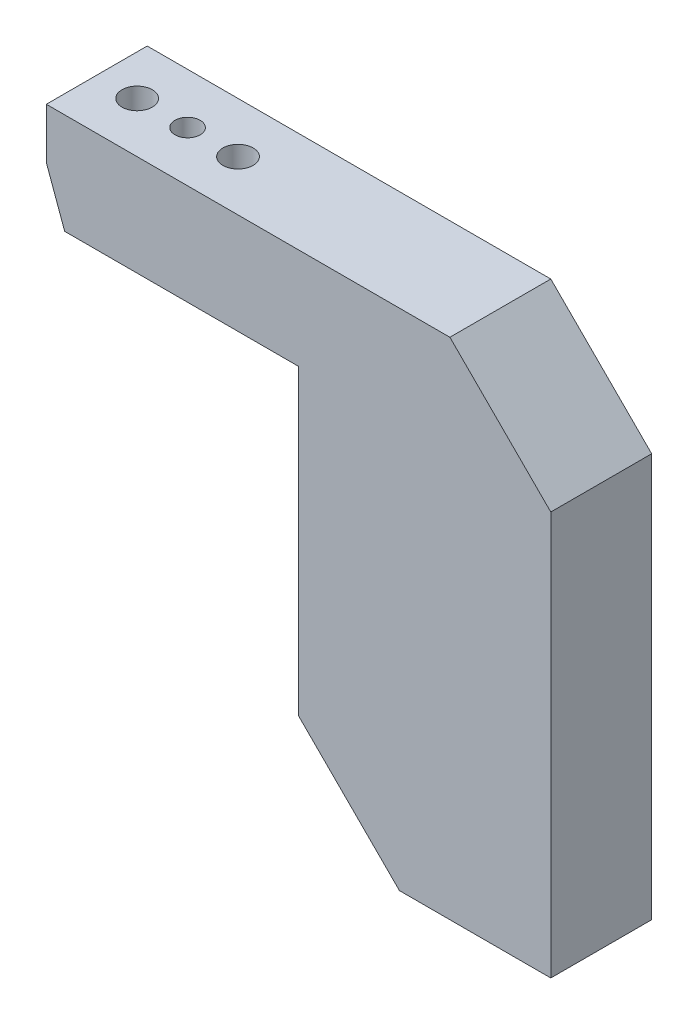
ISO-10303-21;
HEADER;
FILE_DESCRIPTION(('STEP AP214'),'2;1');
FILE_NAME('part.step','',(''),(''),'','','');
FILE_SCHEMA(('AUTOMOTIVE_DESIGN { 1 0 10303 214 1 1 1 1 }'));
ENDSEC;
DATA;
#1=APPLICATION_CONTEXT('core data for automotive mechanical design processes');
#2=APPLICATION_PROTOCOL_DEFINITION('international standard','automotive_design',2000,#1);
#3=PRODUCT_CONTEXT('',#1,'mechanical');
#4=PRODUCT('Part','Part','',(#3));
#5=PRODUCT_RELATED_PRODUCT_CATEGORY('part','',(#4));
#6=PRODUCT_DEFINITION_FORMATION('','',#4);
#7=PRODUCT_DEFINITION_CONTEXT('part definition',#1,'design');
#8=PRODUCT_DEFINITION('design','',#6,#7);
#9=PRODUCT_DEFINITION_SHAPE('','',#8);
#10=(LENGTH_UNIT() NAMED_UNIT(*) SI_UNIT(.MILLI.,.METRE.));
#11=(NAMED_UNIT(*) PLANE_ANGLE_UNIT() SI_UNIT($,.RADIAN.));
#12=(NAMED_UNIT(*) SI_UNIT($,.STERADIAN.) SOLID_ANGLE_UNIT());
#13=UNCERTAINTY_MEASURE_WITH_UNIT(LENGTH_MEASURE(1.E-05),#10,'distance_accuracy_value','');
#14=(GEOMETRIC_REPRESENTATION_CONTEXT(3) GLOBAL_UNCERTAINTY_ASSIGNED_CONTEXT((#13)) GLOBAL_UNIT_ASSIGNED_CONTEXT((#10,
#11,#12)) REPRESENTATION_CONTEXT('',''));
#15=CARTESIAN_POINT('',(0.,0.,0.));
#16=DIRECTION('',(0.,0.,1.));
#17=DIRECTION('',(1.,0.,0.));
#18=AXIS2_PLACEMENT_3D('',#15,#16,#17);
#19=CARTESIAN_POINT('',(-50.,-50.,20.));
#20=DIRECTION('',(1.,0.,0.));
#21=DIRECTION('',(0.,0.,-1.));
#22=AXIS2_PLACEMENT_3D('',#19,#20,#21);
#23=PLANE('',#22);
#24=DIRECTION('',(0.,-1.,0.));
#25=VECTOR('',#24,1.);
#26=CARTESIAN_POINT('',(-50.,-50.,0.));
#27=LINE('',#26,#25);
#28=CARTESIAN_POINT('',(-50.,50.,0.));
#29=VERTEX_POINT('',#28);
#30=CARTESIAN_POINT('',(-50.,40.0000000000002,0.));
#31=VERTEX_POINT('',#30);
#32=EDGE_CURVE('E162',#29,#31,#27,.T.);
#33=ORIENTED_EDGE('',*,*,#32,.T.);
#34=DIRECTION('',(0.,0.,1.));
#35=VECTOR('',#34,1.);
#36=CARTESIAN_POINT('',(-50.,40.0000000000002,20.));
#37=LINE('',#36,#35);
#38=CARTESIAN_POINT('',(-50.,40.0000000000001,20.));
#39=VERTEX_POINT('',#38);
#40=EDGE_CURVE('E189',#31,#39,#37,.T.);
#41=ORIENTED_EDGE('',*,*,#40,.T.);
#42=DIRECTION('',(0.,-1.,0.));
#43=VECTOR('',#42,1.);
#44=CARTESIAN_POINT('',(-50.,-50.,20.));
#45=LINE('',#44,#43);
#46=CARTESIAN_POINT('',(-50.,50.,20.));
#47=VERTEX_POINT('',#46);
#48=EDGE_CURVE('E163',#47,#39,#45,.T.);
#49=ORIENTED_EDGE('',*,*,#48,.F.);
#50=DIRECTION('',(0.,0.,-1.));
#51=VECTOR('',#50,1.);
#52=CARTESIAN_POINT('',(-50.,50.,20.));
#53=LINE('',#52,#51);
#54=EDGE_CURVE('E172',#47,#29,#53,.T.);
#55=ORIENTED_EDGE('',*,*,#54,.T.);
#56=EDGE_LOOP('',(#33,#41,#49,#55));
#57=FACE_BOUND('',#56,.T.);
#58=ADVANCED_FACE('F39',(#57),#23,.F.);
#59=CARTESIAN_POINT('',(50.,-50.,20.));
#60=DIRECTION('',(0.,1.,0.));
#61=DIRECTION('',(-1.,0.,0.));
#62=AXIS2_PLACEMENT_3D('',#59,#60,#61);
#63=PLANE('',#62);
#64=DIRECTION('',(1.,0.,0.));
#65=VECTOR('',#64,1.);
#66=CARTESIAN_POINT('',(50.,-50.,20.));
#67=LINE('',#66,#65);
#68=CARTESIAN_POINT('',(20.0000000000001,-50.,20.));
#69=VERTEX_POINT('',#68);
#70=CARTESIAN_POINT('',(50.,-50.,20.));
#71=VERTEX_POINT('',#70);
#72=EDGE_CURVE('E165',#69,#71,#67,.T.);
#73=ORIENTED_EDGE('',*,*,#72,.F.);
#74=DIRECTION('',(0.,0.,-1.));
#75=VECTOR('',#74,1.);
#76=CARTESIAN_POINT('',(20.,-50.,20.));
#77=LINE('',#76,#75);
#78=CARTESIAN_POINT('',(20.,-50.,0.));
#79=VERTEX_POINT('',#78);
#80=EDGE_CURVE('E192',#69,#79,#77,.T.);
#81=ORIENTED_EDGE('',*,*,#80,.T.);
#82=DIRECTION('',(1.,0.,0.));
#83=VECTOR('',#82,1.);
#84=CARTESIAN_POINT('',(50.,-50.,0.));
#85=LINE('',#84,#83);
#86=CARTESIAN_POINT('',(50.,-50.,0.));
#87=VERTEX_POINT('',#86);
#88=EDGE_CURVE('E175',#79,#87,#85,.T.);
#89=ORIENTED_EDGE('',*,*,#88,.T.);
#90=DIRECTION('',(0.,0.,-1.));
#91=VECTOR('',#90,1.);
#92=CARTESIAN_POINT('',(50.,-50.,20.));
#93=LINE('',#92,#91);
#94=EDGE_CURVE('E182',#71,#87,#93,.T.);
#95=ORIENTED_EDGE('',*,*,#94,.F.);
#96=EDGE_LOOP('',(#73,#81,#89,#95));
#97=FACE_BOUND('',#96,.T.);
#98=ADVANCED_FACE('F224',(#97),#63,.F.);
#99=CARTESIAN_POINT('',(50.,-50.,20.));
#100=DIRECTION('',(-1.,0.,0.));
#101=DIRECTION('',(0.,0.,1.));
#102=AXIS2_PLACEMENT_3D('',#99,#100,#101);
#103=PLANE('',#102);
#104=DIRECTION('',(0.,1.,0.));
#105=VECTOR('',#104,1.);
#106=CARTESIAN_POINT('',(50.,-50.,0.));
#107=LINE('',#106,#105);
#108=CARTESIAN_POINT('',(50.,29.9999999999999,0.));
#109=VERTEX_POINT('',#108);
#110=EDGE_CURVE('E177',#87,#109,#107,.T.);
#111=ORIENTED_EDGE('',*,*,#110,.T.);
#112=DIRECTION('',(0.,0.,1.));
#113=VECTOR('',#112,1.);
#114=CARTESIAN_POINT('',(50.,29.9999999999999,20.));
#115=LINE('',#114,#113);
#116=CARTESIAN_POINT('',(50.,29.9999999999999,20.));
#117=VERTEX_POINT('',#116);
#118=EDGE_CURVE('E47',#109,#117,#115,.T.);
#119=ORIENTED_EDGE('',*,*,#118,.T.);
#120=DIRECTION('',(0.,1.,0.));
#121=VECTOR('',#120,1.);
#122=CARTESIAN_POINT('',(50.,-50.,20.));
#123=LINE('',#122,#121);
#124=EDGE_CURVE('E168',#71,#117,#123,.T.);
#125=ORIENTED_EDGE('',*,*,#124,.F.);
#126=ORIENTED_EDGE('',*,*,#94,.T.);
#127=EDGE_LOOP('',(#111,#119,#125,#126));
#128=FACE_BOUND('',#127,.T.);
#129=ADVANCED_FACE('F225',(#128),#103,.F.);
#130=CARTESIAN_POINT('',(50.,50.,20.));
#131=DIRECTION('',(0.,-1.,0.));
#132=DIRECTION('',(1.,0.,0.));
#133=AXIS2_PLACEMENT_3D('',#130,#131,#132);
#134=PLANE('',#133);
#135=CARTESIAN_POINT('',(-32.,50.,10.));
#136=DIRECTION('',(0.,1.,0.));
#137=DIRECTION('',(0.,0.,1.));
#138=AXIS2_PLACEMENT_3D('',#135,#136,#137);
#139=CIRCLE('',#138,2.5);
#140=CARTESIAN_POINT('',(-32.,50.,12.5));
#141=VERTEX_POINT('',#140);
#142=EDGE_CURVE('E150',#141,#141,#139,.T.);
#143=ORIENTED_EDGE('',*,*,#142,.F.);
#144=EDGE_LOOP('',(#143));
#145=FACE_BOUND('',#144,.T.);
#146=CARTESIAN_POINT('',(-22.,50.,10.));
#147=DIRECTION('',(0.,1.,0.));
#148=DIRECTION('',(0.,0.,1.));
#149=AXIS2_PLACEMENT_3D('',#146,#147,#148);
#150=CIRCLE('',#149,3.);
#151=CARTESIAN_POINT('',(-22.,50.,13.));
#152=VERTEX_POINT('',#151);
#153=EDGE_CURVE('E156',#152,#152,#150,.T.);
#154=ORIENTED_EDGE('',*,*,#153,.F.);
#155=EDGE_LOOP('',(#154));
#156=FACE_BOUND('',#155,.T.);
#157=CARTESIAN_POINT('',(-42.,50.,10.));
#158=DIRECTION('',(0.,1.,0.));
#159=DIRECTION('',(0.,0.,1.));
#160=AXIS2_PLACEMENT_3D('',#157,#158,#159);
#161=CIRCLE('',#160,3.);
#162=CARTESIAN_POINT('',(-42.,50.,13.));
#163=VERTEX_POINT('',#162);
#164=EDGE_CURVE('E159',#163,#163,#161,.T.);
#165=ORIENTED_EDGE('',*,*,#164,.F.);
#166=EDGE_LOOP('',(#165));
#167=FACE_BOUND('',#166,.T.);
#168=DIRECTION('',(-1.,0.,0.));
#169=VECTOR('',#168,1.);
#170=CARTESIAN_POINT('',(50.,50.,20.));
#171=LINE('',#170,#169);
#172=CARTESIAN_POINT('',(30.,50.,20.));
#173=VERTEX_POINT('',#172);
#174=EDGE_CURVE('E170',#173,#47,#171,.T.);
#175=ORIENTED_EDGE('',*,*,#174,.F.);
#176=DIRECTION('',(0.,0.,-1.));
#177=VECTOR('',#176,1.);
#178=CARTESIAN_POINT('',(30.,50.,20.));
#179=LINE('',#178,#177);
#180=CARTESIAN_POINT('',(30.,50.,0.));
#181=VERTEX_POINT('',#180);
#182=EDGE_CURVE('E200',#173,#181,#179,.T.);
#183=ORIENTED_EDGE('',*,*,#182,.T.);
#184=DIRECTION('',(-1.,0.,0.));
#185=VECTOR('',#184,1.);
#186=CARTESIAN_POINT('',(50.,50.,0.));
#187=LINE('',#186,#185);
#188=EDGE_CURVE('E166',#181,#29,#187,.T.);
#189=ORIENTED_EDGE('',*,*,#188,.T.);
#190=ORIENTED_EDGE('',*,*,#54,.F.);
#191=EDGE_LOOP('',(#175,#183,#189,#190));
#192=FACE_BOUND('',#191,.T.);
#193=ADVANCED_FACE('F206',(#145,#156,#167,#192),#134,.F.);
#194=CARTESIAN_POINT('',(0.,0.,20.));
#195=DIRECTION('',(0.,0.,1.));
#196=DIRECTION('',(1.,0.,0.));
#197=AXIS2_PLACEMENT_3D('',#194,#195,#196);
#198=PLANE('',#197);
#199=ORIENTED_EDGE('',*,*,#124,.T.);
#200=DIRECTION('',(0.707106781186546,-0.707106781186549,0.));
#201=VECTOR('',#200,1.);
#202=CARTESIAN_POINT('',(40.,39.9999999999999,20.));
#203=LINE('',#202,#201);
#204=EDGE_CURVE('E11',#117,#173,#203,.F.);
#205=ORIENTED_EDGE('',*,*,#204,.T.);
#206=ORIENTED_EDGE('',*,*,#174,.T.);
#207=ORIENTED_EDGE('',*,*,#48,.T.);
#208=DIRECTION('',(-0.342020143325666,0.939692620785909,0.));
#209=VECTOR('',#208,1.);
#210=CARTESIAN_POINT('',(-31.2953588842438,-11.390579104543,20.));
#211=LINE('',#210,#209);
#212=CARTESIAN_POINT('',(-46.360297657338,30.,20.));
#213=VERTEX_POINT('',#212);
#214=EDGE_CURVE('E121',#39,#213,#211,.F.);
#215=ORIENTED_EDGE('',*,*,#214,.T.);
#216=DIRECTION('',(1.,0.,0.));
#217=VECTOR('',#216,1.);
#218=CARTESIAN_POINT('',(-50.,30.,20.));
#219=LINE('',#218,#217);
#220=CARTESIAN_POINT('',(0.,30.,20.));
#221=VERTEX_POINT('',#220);
#222=EDGE_CURVE('E113',#213,#221,#219,.T.);
#223=ORIENTED_EDGE('',*,*,#222,.T.);
#224=DIRECTION('',(0.,-1.,0.));
#225=VECTOR('',#224,1.);
#226=CARTESIAN_POINT('',(0.,30.,20.));
#227=LINE('',#226,#225);
#228=CARTESIAN_POINT('',(0.,-29.9999999999999,20.));
#229=VERTEX_POINT('',#228);
#230=EDGE_CURVE('E117',#221,#229,#227,.T.);
#231=ORIENTED_EDGE('',*,*,#230,.T.);
#232=DIRECTION('',(-0.707106781186546,0.707106781186549,0.));
#233=VECTOR('',#232,1.);
#234=CARTESIAN_POINT('',(-14.9999999999999,-14.9999999999999,20.));
#235=LINE('',#234,#233);
#236=EDGE_CURVE('E198',#229,#69,#235,.F.);
#237=ORIENTED_EDGE('',*,*,#236,.T.);
#238=ORIENTED_EDGE('',*,*,#72,.T.);
#239=EDGE_LOOP('',(#199,#205,#206,#207,#215,#223,#231,#237,#238));
#240=FACE_BOUND('',#239,.T.);
#241=ADVANCED_FACE('F115',(#240),#198,.T.);
#242=CARTESIAN_POINT('',(0.,0.,0.));
#243=DIRECTION('',(0.,0.,1.));
#244=DIRECTION('',(1.,0.,0.));
#245=AXIS2_PLACEMENT_3D('',#242,#243,#244);
#246=PLANE('',#245);
#247=ORIENTED_EDGE('',*,*,#188,.F.);
#248=DIRECTION('',(-0.707106781186546,0.707106781186549,0.));
#249=VECTOR('',#248,1.);
#250=CARTESIAN_POINT('',(30.,50.,0.));
#251=LINE('',#250,#249);
#252=EDGE_CURVE('E61',#181,#109,#251,.F.);
#253=ORIENTED_EDGE('',*,*,#252,.T.);
#254=ORIENTED_EDGE('',*,*,#110,.F.);
#255=ORIENTED_EDGE('',*,*,#88,.F.);
#256=DIRECTION('',(0.707106781186546,-0.707106781186549,0.));
#257=VECTOR('',#256,1.);
#258=CARTESIAN_POINT('',(20.,-50.,0.));
#259=LINE('',#258,#257);
#260=CARTESIAN_POINT('',(0.,-29.9999999999999,0.));
#261=VERTEX_POINT('',#260);
#262=EDGE_CURVE('E195',#79,#261,#259,.F.);
#263=ORIENTED_EDGE('',*,*,#262,.T.);
#264=DIRECTION('',(0.,-1.,0.));
#265=VECTOR('',#264,1.);
#266=CARTESIAN_POINT('',(0.,30.,0.));
#267=LINE('',#266,#265);
#268=CARTESIAN_POINT('',(0.,30.,0.));
#269=VERTEX_POINT('',#268);
#270=EDGE_CURVE('E125',#269,#261,#267,.T.);
#271=ORIENTED_EDGE('',*,*,#270,.F.);
#272=DIRECTION('',(1.,0.,0.));
#273=VECTOR('',#272,1.);
#274=CARTESIAN_POINT('',(-50.,30.,0.));
#275=LINE('',#274,#273);
#276=CARTESIAN_POINT('',(-46.360297657338,30.,0.));
#277=VERTEX_POINT('',#276);
#278=EDGE_CURVE('E132',#277,#269,#275,.T.);
#279=ORIENTED_EDGE('',*,*,#278,.F.);
#280=DIRECTION('',(0.342020143325666,-0.939692620785909,0.));
#281=VECTOR('',#280,1.);
#282=CARTESIAN_POINT('',(-46.360297657338,30.,0.));
#283=LINE('',#282,#281);
#284=EDGE_CURVE('E187',#277,#31,#283,.F.);
#285=ORIENTED_EDGE('',*,*,#284,.T.);
#286=ORIENTED_EDGE('',*,*,#32,.F.);
#287=EDGE_LOOP('',(#247,#253,#254,#255,#263,#271,#279,#285,#286));
#288=FACE_BOUND('',#287,.T.);
#289=ADVANCED_FACE('F211',(#288),#246,.F.);
#290=CARTESIAN_POINT('',(-42.,50.,10.));
#291=DIRECTION('',(0.,1.,0.));
#292=DIRECTION('',(0.,0.,1.));
#293=AXIS2_PLACEMENT_3D('',#290,#291,#292);
#294=CYLINDRICAL_SURFACE('',#293,3.);
#295=CARTESIAN_POINT('',(-42.,30.,10.));
#296=DIRECTION('',(0.,1.,0.));
#297=DIRECTION('',(-1.,0.,0.));
#298=AXIS2_PLACEMENT_3D('',#295,#296,#297);
#299=CIRCLE('',#298,3.);
#300=CARTESIAN_POINT('',(-45.,30.,10.));
#301=VERTEX_POINT('',#300);
#302=EDGE_CURVE('E147',#301,#301,#299,.F.);
#303=ORIENTED_EDGE('',*,*,#302,.T.);
#304=EDGE_LOOP('',(#303));
#305=FACE_BOUND('',#304,.T.);
#306=ORIENTED_EDGE('',*,*,#164,.T.);
#307=EDGE_LOOP('',(#306));
#308=FACE_BOUND('',#307,.T.);
#309=ADVANCED_FACE('F262',(#305,#308),#294,.F.);
#310=CARTESIAN_POINT('',(-22.,50.,10.));
#311=DIRECTION('',(0.,1.,0.));
#312=DIRECTION('',(0.,0.,1.));
#313=AXIS2_PLACEMENT_3D('',#310,#311,#312);
#314=CYLINDRICAL_SURFACE('',#313,3.);
#315=CARTESIAN_POINT('',(-22.,30.,10.));
#316=DIRECTION('',(0.,1.,0.));
#317=DIRECTION('',(-1.,0.,0.));
#318=AXIS2_PLACEMENT_3D('',#315,#316,#317);
#319=CIRCLE('',#318,3.);
#320=CARTESIAN_POINT('',(-25.,30.,10.));
#321=VERTEX_POINT('',#320);
#322=EDGE_CURVE('E136',#321,#321,#319,.F.);
#323=ORIENTED_EDGE('',*,*,#322,.T.);
#324=EDGE_LOOP('',(#323));
#325=FACE_BOUND('',#324,.T.);
#326=ORIENTED_EDGE('',*,*,#153,.T.);
#327=EDGE_LOOP('',(#326));
#328=FACE_BOUND('',#327,.T.);
#329=ADVANCED_FACE('F258',(#325,#328),#314,.F.);
#330=CARTESIAN_POINT('',(-32.,35.,10.));
#331=DIRECTION('',(0.,1.,0.));
#332=DIRECTION('',(0.,0.,1.));
#333=AXIS2_PLACEMENT_3D('',#330,#331,#332);
#334=CONICAL_SURFACE('',#333,2.5,1.02974425867665);
#335=CARTESIAN_POINT('',(-32.,33.4978484524311,10.));
#336=VERTEX_POINT('',#335);
#337=VERTEX_LOOP('',#336);
#338=FACE_BOUND('',#337,.T.);
#339=CARTESIAN_POINT('',(-32.,35.,10.));
#340=DIRECTION('',(0.,1.,0.));
#341=DIRECTION('',(0.,0.,1.));
#342=AXIS2_PLACEMENT_3D('',#339,#340,#341);
#343=CIRCLE('',#342,2.5);
#344=CARTESIAN_POINT('',(-32.,35.,12.5));
#345=VERTEX_POINT('',#344);
#346=EDGE_CURVE('E153',#345,#345,#343,.T.);
#347=ORIENTED_EDGE('',*,*,#346,.T.);
#348=EDGE_LOOP('',(#347));
#349=FACE_BOUND('',#348,.T.);
#350=ADVANCED_FACE('F254',(#338,#349),#334,.F.);
#351=CARTESIAN_POINT('',(-32.,50.,10.));
#352=DIRECTION('',(0.,1.,0.));
#353=DIRECTION('',(0.,0.,1.));
#354=AXIS2_PLACEMENT_3D('',#351,#352,#353);
#355=CYLINDRICAL_SURFACE('',#354,2.5);
#356=ORIENTED_EDGE('',*,*,#346,.F.);
#357=EDGE_LOOP('',(#356));
#358=FACE_BOUND('',#357,.T.);
#359=ORIENTED_EDGE('',*,*,#142,.T.);
#360=EDGE_LOOP('',(#359));
#361=FACE_BOUND('',#360,.T.);
#362=ADVANCED_FACE('F248',(#358,#361),#355,.F.);
#363=CARTESIAN_POINT('',(-50.,30.,20.));
#364=DIRECTION('',(0.,1.,0.));
#365=DIRECTION('',(-1.,0.,0.));
#366=AXIS2_PLACEMENT_3D('',#363,#364,#365);
#367=PLANE('',#366);
#368=ORIENTED_EDGE('',*,*,#322,.F.);
#369=EDGE_LOOP('',(#368));
#370=FACE_BOUND('',#369,.T.);
#371=ORIENTED_EDGE('',*,*,#222,.F.);
#372=DIRECTION('',(0.,0.,-1.));
#373=VECTOR('',#372,1.);
#374=CARTESIAN_POINT('',(-46.360297657338,30.,20.));
#375=LINE('',#374,#373);
#376=EDGE_CURVE('E185',#213,#277,#375,.T.);
#377=ORIENTED_EDGE('',*,*,#376,.T.);
#378=ORIENTED_EDGE('',*,*,#278,.T.);
#379=DIRECTION('',(0.,0.,-1.));
#380=VECTOR('',#379,1.);
#381=CARTESIAN_POINT('',(0.,30.,20.));
#382=LINE('',#381,#380);
#383=EDGE_CURVE('E128',#221,#269,#382,.T.);
#384=ORIENTED_EDGE('',*,*,#383,.F.);
#385=EDGE_LOOP('',(#371,#377,#378,#384));
#386=FACE_BOUND('',#385,.T.);
#387=ORIENTED_EDGE('',*,*,#302,.F.);
#388=EDGE_LOOP('',(#387));
#389=FACE_BOUND('',#388,.T.);
#390=ADVANCED_FACE('F129',(#370,#386,#389),#367,.F.);
#391=CARTESIAN_POINT('',(0.,30.,20.));
#392=DIRECTION('',(1.,0.,0.));
#393=DIRECTION('',(0.,1.,0.));
#394=AXIS2_PLACEMENT_3D('',#391,#392,#393);
#395=PLANE('',#394);
#396=ORIENTED_EDGE('',*,*,#270,.T.);
#397=DIRECTION('',(0.,0.,1.));
#398=VECTOR('',#397,1.);
#399=CARTESIAN_POINT('',(0.,-29.9999999999999,20.));
#400=LINE('',#399,#398);
#401=EDGE_CURVE('E140',#261,#229,#400,.T.);
#402=ORIENTED_EDGE('',*,*,#401,.T.);
#403=ORIENTED_EDGE('',*,*,#230,.F.);
#404=ORIENTED_EDGE('',*,*,#383,.T.);
#405=EDGE_LOOP('',(#396,#402,#403,#404));
#406=FACE_BOUND('',#405,.T.);
#407=ADVANCED_FACE('F138',(#406),#395,.F.);
#408=CARTESIAN_POINT('',(-46.360297657338,30.,20.));
#409=DIRECTION('',(0.939692620785909,0.342020143325666,0.));
#410=DIRECTION('',(0.,0.,-1.));
#411=AXIS2_PLACEMENT_3D('',#408,#409,#410);
#412=PLANE('',#411);
#413=ORIENTED_EDGE('',*,*,#214,.F.);
#414=ORIENTED_EDGE('',*,*,#40,.F.);
#415=ORIENTED_EDGE('',*,*,#284,.F.);
#416=ORIENTED_EDGE('',*,*,#376,.F.);
#417=EDGE_LOOP('',(#413,#414,#415,#416));
#418=FACE_BOUND('',#417,.T.);
#419=ADVANCED_FACE('F216',(#418),#412,.F.);
#420=CARTESIAN_POINT('',(20.,-50.,20.));
#421=DIRECTION('',(0.707106781186549,0.707106781186546,0.));
#422=DIRECTION('',(0.,0.,-1.));
#423=AXIS2_PLACEMENT_3D('',#420,#421,#422);
#424=PLANE('',#423);
#425=ORIENTED_EDGE('',*,*,#236,.F.);
#426=ORIENTED_EDGE('',*,*,#401,.F.);
#427=ORIENTED_EDGE('',*,*,#262,.F.);
#428=ORIENTED_EDGE('',*,*,#80,.F.);
#429=EDGE_LOOP('',(#425,#426,#427,#428));
#430=FACE_BOUND('',#429,.T.);
#431=ADVANCED_FACE('F219',(#430),#424,.F.);
#432=CARTESIAN_POINT('',(30.,50.,20.));
#433=DIRECTION('',(-0.707106781186549,-0.707106781186546,0.));
#434=DIRECTION('',(0.,0.,-1.));
#435=AXIS2_PLACEMENT_3D('',#432,#433,#434);
#436=PLANE('',#435);
#437=ORIENTED_EDGE('',*,*,#204,.F.);
#438=ORIENTED_EDGE('',*,*,#118,.F.);
#439=ORIENTED_EDGE('',*,*,#252,.F.);
#440=ORIENTED_EDGE('',*,*,#182,.F.);
#441=EDGE_LOOP('',(#437,#438,#439,#440));
#442=FACE_BOUND('',#441,.T.);
#443=ADVANCED_FACE('F41',(#442),#436,.F.);
#444=CLOSED_SHELL('',(#58,#98,#129,#193,#241,#289,#309,#329,#350,#362,#390,#407,#419,#431,#443));
#445=MANIFOLD_SOLID_BREP('B2',#444);
#446=ADVANCED_BREP_SHAPE_REPRESENTATION('',(#18,#445),#14);
#447=SHAPE_DEFINITION_REPRESENTATION(#9,#446);
ENDSEC;
END-ISO-10303-21;
